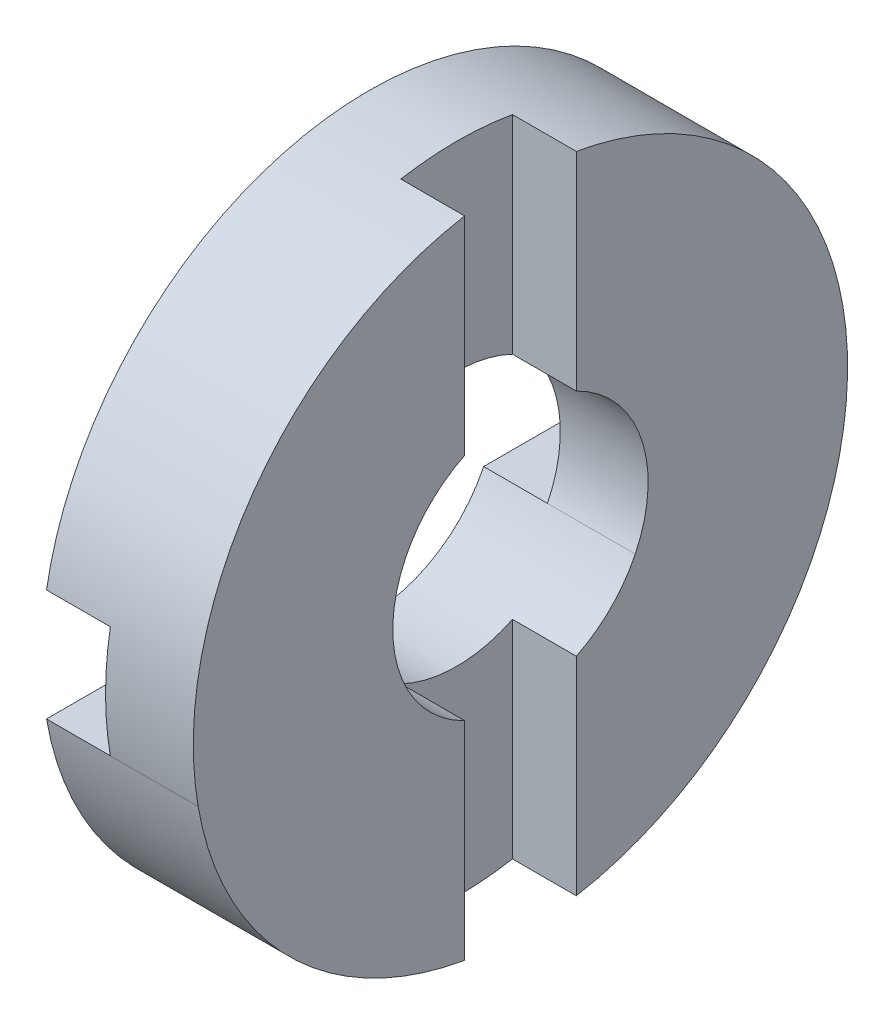
ISO-10303-21;
HEADER;
FILE_DESCRIPTION(('STEP AP214'),'2;1');
FILE_NAME('part.step','',(''),(''),'','','');
FILE_SCHEMA(('AUTOMOTIVE_DESIGN { 1 0 10303 214 1 1 1 1 }'));
ENDSEC;
DATA;
#1=APPLICATION_CONTEXT('core data for automotive mechanical design processes');
#2=APPLICATION_PROTOCOL_DEFINITION('international standard','automotive_design',2000,#1);
#3=PRODUCT_CONTEXT('',#1,'mechanical');
#4=PRODUCT('Part','Part','',(#3));
#5=PRODUCT_RELATED_PRODUCT_CATEGORY('part','',(#4));
#6=PRODUCT_DEFINITION_FORMATION('','',#4);
#7=PRODUCT_DEFINITION_CONTEXT('part definition',#1,'design');
#8=PRODUCT_DEFINITION('design','',#6,#7);
#9=PRODUCT_DEFINITION_SHAPE('','',#8);
#10=(LENGTH_UNIT() NAMED_UNIT(*) SI_UNIT(.MILLI.,.METRE.));
#11=(NAMED_UNIT(*) PLANE_ANGLE_UNIT() SI_UNIT($,.RADIAN.));
#12=(NAMED_UNIT(*) SI_UNIT($,.STERADIAN.) SOLID_ANGLE_UNIT());
#13=UNCERTAINTY_MEASURE_WITH_UNIT(LENGTH_MEASURE(1.E-05),#10,'distance_accuracy_value','');
#14=(GEOMETRIC_REPRESENTATION_CONTEXT(3) GLOBAL_UNCERTAINTY_ASSIGNED_CONTEXT((#13)) GLOBAL_UNIT_ASSIGNED_CONTEXT((#10,
#11,#12)) REPRESENTATION_CONTEXT('',''));
#15=CARTESIAN_POINT('',(0.,0.,0.));
#16=DIRECTION('',(0.,0.,1.));
#17=DIRECTION('',(1.,0.,0.));
#18=AXIS2_PLACEMENT_3D('',#15,#16,#17);
#19=CARTESIAN_POINT('',(9.5,8.,0.));
#20=DIRECTION('',(1.,0.,0.));
#21=DIRECTION('',(0.,0.,-1.));
#22=AXIS2_PLACEMENT_3D('',#19,#20,#21);
#23=PLANE('',#22);
#24=CARTESIAN_POINT('',(9.5,0.,0.));
#25=DIRECTION('',(1.,0.,0.));
#26=DIRECTION('',(0.,0.,-1.));
#27=AXIS2_PLACEMENT_3D('',#24,#25,#26);
#28=CIRCLE('',#27,20.5);
#29=CARTESIAN_POINT('',(9.5,-20.1990098767242,-3.5));
#30=VERTEX_POINT('',#29);
#31=CARTESIAN_POINT('',(9.5,3.5,-20.1990098767242));
#32=VERTEX_POINT('',#31);
#33=EDGE_CURVE('E11',#30,#32,#28,.T.);
#34=ORIENTED_EDGE('',*,*,#33,.T.);
#35=CARTESIAN_POINT('',(9.5,0.,0.));
#36=DIRECTION('',(1.,0.,0.));
#37=DIRECTION('',(0.,0.,-1.));
#38=AXIS2_PLACEMENT_3D('',#35,#36,#37);
#39=CIRCLE('',#38,20.5);
#40=CARTESIAN_POINT('',(9.5,20.1990098767242,-3.5));
#41=VERTEX_POINT('',#40);
#42=EDGE_CURVE('E24',#32,#41,#39,.T.);
#43=ORIENTED_EDGE('',*,*,#42,.T.);
#44=DIRECTION('',(0.,-1.,0.));
#45=VECTOR('',#44,1.);
#46=CARTESIAN_POINT('',(9.5,20.5,-3.5));
#47=LINE('',#46,#45);
#48=CARTESIAN_POINT('',(9.5,7.19374728496908,-3.5));
#49=VERTEX_POINT('',#48);
#50=EDGE_CURVE('E378',#41,#49,#47,.T.);
#51=ORIENTED_EDGE('',*,*,#50,.T.);
#52=CARTESIAN_POINT('',(9.5,0.,0.));
#53=DIRECTION('',(1.,0.,0.));
#54=DIRECTION('',(0.,0.,-1.));
#55=AXIS2_PLACEMENT_3D('',#52,#53,#54);
#56=CIRCLE('',#55,8.);
#57=CARTESIAN_POINT('',(9.5,-3.5,-7.19374728496908));
#58=VERTEX_POINT('',#57);
#59=EDGE_CURVE('E373',#58,#49,#56,.T.);
#60=ORIENTED_EDGE('',*,*,#59,.F.);
#61=CARTESIAN_POINT('',(9.5,0.,0.));
#62=DIRECTION('',(1.,0.,0.));
#63=DIRECTION('',(0.,0.,-1.));
#64=AXIS2_PLACEMENT_3D('',#61,#62,#63);
#65=CIRCLE('',#64,8.);
#66=CARTESIAN_POINT('',(9.5,-7.19374728496908,-3.5));
#67=VERTEX_POINT('',#66);
#68=EDGE_CURVE('E368',#67,#58,#65,.T.);
#69=ORIENTED_EDGE('',*,*,#68,.F.);
#70=DIRECTION('',(0.,-1.,0.));
#71=VECTOR('',#70,1.);
#72=CARTESIAN_POINT('',(9.5,8.,-3.5));
#73=LINE('',#72,#71);
#74=EDGE_CURVE('E364',#67,#30,#73,.T.);
#75=ORIENTED_EDGE('',*,*,#74,.T.);
#76=EDGE_LOOP('',(#34,#43,#51,#60,#69,#75));
#77=FACE_BOUND('',#76,.T.);
#78=ADVANCED_FACE('F16',(#77),#23,.T.);
#79=CARTESIAN_POINT('',(9.5,20.5,-3.5));
#80=DIRECTION('',(0.,0.,1.));
#81=DIRECTION('',(1.,0.,0.));
#82=AXIS2_PLACEMENT_3D('',#79,#80,#81);
#83=PLANE('',#82);
#84=DIRECTION('',(0.,-1.,0.));
#85=VECTOR('',#84,1.);
#86=CARTESIAN_POINT('',(5.5,20.5,-3.5));
#87=LINE('',#86,#85);
#88=CARTESIAN_POINT('',(5.5,-7.19374728496908,-3.5));
#89=VERTEX_POINT('',#88);
#90=CARTESIAN_POINT('',(5.5,-20.1990098767242,-3.5));
#91=VERTEX_POINT('',#90);
#92=EDGE_CURVE('E360',#89,#91,#87,.T.);
#93=ORIENTED_EDGE('',*,*,#92,.T.);
#94=DIRECTION('',(1.,0.,0.));
#95=VECTOR('',#94,1.);
#96=CARTESIAN_POINT('',(9.5,-20.1990098767242,-3.5));
#97=LINE('',#96,#95);
#98=EDGE_CURVE('E355',#91,#30,#97,.T.);
#99=ORIENTED_EDGE('',*,*,#98,.T.);
#100=ORIENTED_EDGE('',*,*,#74,.F.);
#101=DIRECTION('',(1.,0.,0.));
#102=VECTOR('',#101,1.);
#103=CARTESIAN_POINT('',(9.5,-7.19374728496908,-3.5));
#104=LINE('',#103,#102);
#105=EDGE_CURVE('E350',#89,#67,#104,.T.);
#106=ORIENTED_EDGE('',*,*,#105,.F.);
#107=EDGE_LOOP('',(#93,#99,#100,#106));
#108=FACE_BOUND('',#107,.T.);
#109=ADVANCED_FACE('F439',(#108),#83,.T.);
#110=CARTESIAN_POINT('',(9.5,0.,0.));
#111=DIRECTION('',(-1.,0.,0.));
#112=DIRECTION('',(0.,0.899218410621135,-0.4375));
#113=AXIS2_PLACEMENT_3D('',#110,#111,#112);
#114=CYLINDRICAL_SURFACE('',#113,8.);
#115=CARTESIAN_POINT('',(4.,0.,0.));
#116=DIRECTION('',(-1.,0.,0.));
#117=DIRECTION('',(0.,0.,1.));
#118=AXIS2_PLACEMENT_3D('',#115,#116,#117);
#119=CIRCLE('',#118,8.);
#120=CARTESIAN_POINT('',(4.,-3.5,7.19374728496908));
#121=VERTEX_POINT('',#120);
#122=CARTESIAN_POINT('',(4.,3.5,7.19374728496908));
#123=VERTEX_POINT('',#122);
#124=EDGE_CURVE('E346',#121,#123,#119,.T.);
#125=ORIENTED_EDGE('',*,*,#124,.T.);
#126=DIRECTION('',(-1.,0.,0.));
#127=VECTOR('',#126,1.);
#128=CARTESIAN_POINT('',(9.5,3.5,7.19374728496908));
#129=LINE('',#128,#127);
#130=CARTESIAN_POINT('',(9.5,3.5,7.19374728496908));
#131=VERTEX_POINT('',#130);
#132=EDGE_CURVE('E341',#131,#123,#129,.T.);
#133=ORIENTED_EDGE('',*,*,#132,.F.);
#134=CARTESIAN_POINT('',(9.5,0.,0.));
#135=DIRECTION('',(1.,0.,0.));
#136=DIRECTION('',(0.,0.,-1.));
#137=AXIS2_PLACEMENT_3D('',#134,#135,#136);
#138=CIRCLE('',#137,8.);
#139=CARTESIAN_POINT('',(9.5,-7.19374728496908,3.5));
#140=VERTEX_POINT('',#139);
#141=EDGE_CURVE('E337',#131,#140,#138,.T.);
#142=ORIENTED_EDGE('',*,*,#141,.T.);
#143=DIRECTION('',(1.,0.,0.));
#144=VECTOR('',#143,1.);
#145=CARTESIAN_POINT('',(9.5,-7.19374728496908,3.5));
#146=LINE('',#145,#144);
#147=CARTESIAN_POINT('',(5.5,-7.19374728496908,3.5));
#148=VERTEX_POINT('',#147);
#149=EDGE_CURVE('E332',#148,#140,#146,.T.);
#150=ORIENTED_EDGE('',*,*,#149,.F.);
#151=CARTESIAN_POINT('',(5.5,0.,0.));
#152=DIRECTION('',(1.,0.,0.));
#153=DIRECTION('',(0.,0.,-1.));
#154=AXIS2_PLACEMENT_3D('',#151,#152,#153);
#155=CIRCLE('',#154,8.);
#156=EDGE_CURVE('E327',#148,#89,#155,.T.);
#157=ORIENTED_EDGE('',*,*,#156,.T.);
#158=ORIENTED_EDGE('',*,*,#105,.T.);
#159=ORIENTED_EDGE('',*,*,#68,.T.);
#160=DIRECTION('',(-1.,0.,0.));
#161=VECTOR('',#160,1.);
#162=CARTESIAN_POINT('',(9.5,-3.5,-7.19374728496908));
#163=LINE('',#162,#161);
#164=CARTESIAN_POINT('',(4.,-3.5,-7.19374728496908));
#165=VERTEX_POINT('',#164);
#166=EDGE_CURVE('E323',#58,#165,#163,.T.);
#167=ORIENTED_EDGE('',*,*,#166,.T.);
#168=DIRECTION('',(1.,0.,0.));
#169=VECTOR('',#168,1.);
#170=CARTESIAN_POINT('',(9.5,-3.5,-7.19374728496908));
#171=LINE('',#170,#169);
#172=CARTESIAN_POINT('',(0.,-3.5,-7.19374728496908));
#173=VERTEX_POINT('',#172);
#174=EDGE_CURVE('E318',#173,#165,#171,.T.);
#175=ORIENTED_EDGE('',*,*,#174,.F.);
#176=CARTESIAN_POINT('',(0.,0.,0.));
#177=DIRECTION('',(1.,0.,0.));
#178=DIRECTION('',(0.,0.,-1.));
#179=AXIS2_PLACEMENT_3D('',#176,#177,#178);
#180=CIRCLE('',#179,8.);
#181=CARTESIAN_POINT('',(0.,-3.5,7.19374728496908));
#182=VERTEX_POINT('',#181);
#183=EDGE_CURVE('E313',#182,#173,#180,.T.);
#184=ORIENTED_EDGE('',*,*,#183,.F.);
#185=DIRECTION('',(1.,0.,0.));
#186=VECTOR('',#185,1.);
#187=CARTESIAN_POINT('',(9.5,-3.5,7.19374728496908));
#188=LINE('',#187,#186);
#189=EDGE_CURVE('E309',#182,#121,#188,.T.);
#190=ORIENTED_EDGE('',*,*,#189,.T.);
#191=EDGE_LOOP('',(#125,#133,#142,#150,#157,#158,#159,#167,#175,#184,#190));
#192=FACE_BOUND('',#191,.T.);
#193=ADVANCED_FACE('F412',(#192),#114,.F.);
#194=CARTESIAN_POINT('',(0.,-3.5,20.5));
#195=DIRECTION('',(0.,1.,0.));
#196=DIRECTION('',(0.,0.,1.));
#197=AXIS2_PLACEMENT_3D('',#194,#195,#196);
#198=PLANE('',#197);
#199=DIRECTION('',(0.,0.,-1.));
#200=VECTOR('',#199,1.);
#201=CARTESIAN_POINT('',(0.,-3.5,20.5));
#202=LINE('',#201,#200);
#203=CARTESIAN_POINT('',(0.,-3.5,20.1990098767242));
#204=VERTEX_POINT('',#203);
#205=EDGE_CURVE('E304',#204,#182,#202,.T.);
#206=ORIENTED_EDGE('',*,*,#205,.F.);
#207=DIRECTION('',(1.,0.,0.));
#208=VECTOR('',#207,1.);
#209=CARTESIAN_POINT('',(9.5,-3.5,20.1990098767242));
#210=LINE('',#209,#208);
#211=CARTESIAN_POINT('',(4.,-3.5,20.1990098767242));
#212=VERTEX_POINT('',#211);
#213=EDGE_CURVE('E300',#204,#212,#210,.T.);
#214=ORIENTED_EDGE('',*,*,#213,.T.);
#215=DIRECTION('',(0.,0.,-1.));
#216=VECTOR('',#215,1.);
#217=CARTESIAN_POINT('',(4.,-3.5,20.5));
#218=LINE('',#217,#216);
#219=EDGE_CURVE('E295',#212,#121,#218,.T.);
#220=ORIENTED_EDGE('',*,*,#219,.T.);
#221=ORIENTED_EDGE('',*,*,#189,.F.);
#222=EDGE_LOOP('',(#206,#214,#220,#221));
#223=FACE_BOUND('',#222,.T.);
#224=ADVANCED_FACE('F456',(#223),#198,.T.);
#225=CARTESIAN_POINT('',(4.,-3.5,20.5));
#226=DIRECTION('',(-1.,0.,0.));
#227=DIRECTION('',(0.,0.,1.));
#228=AXIS2_PLACEMENT_3D('',#225,#226,#227);
#229=PLANE('',#228);
#230=ORIENTED_EDGE('',*,*,#219,.F.);
#231=CARTESIAN_POINT('',(4.,0.,0.));
#232=DIRECTION('',(-1.,0.,0.));
#233=DIRECTION('',(0.,0.,1.));
#234=AXIS2_PLACEMENT_3D('',#231,#232,#233);
#235=CIRCLE('',#234,20.5);
#236=CARTESIAN_POINT('',(4.,3.5,20.1990098767242));
#237=VERTEX_POINT('',#236);
#238=EDGE_CURVE('E291',#212,#237,#235,.T.);
#239=ORIENTED_EDGE('',*,*,#238,.T.);
#240=DIRECTION('',(0.,0.,-1.));
#241=VECTOR('',#240,1.);
#242=CARTESIAN_POINT('',(4.,3.5,20.5));
#243=LINE('',#242,#241);
#244=EDGE_CURVE('E286',#237,#123,#243,.T.);
#245=ORIENTED_EDGE('',*,*,#244,.T.);
#246=ORIENTED_EDGE('',*,*,#124,.F.);
#247=EDGE_LOOP('',(#230,#239,#245,#246));
#248=FACE_BOUND('',#247,.T.);
#249=ADVANCED_FACE('F418',(#248),#229,.T.);
#250=CARTESIAN_POINT('',(4.,3.5,20.5));
#251=DIRECTION('',(0.,-1.,0.));
#252=DIRECTION('',(0.,0.,-1.));
#253=AXIS2_PLACEMENT_3D('',#250,#251,#252);
#254=PLANE('',#253);
#255=ORIENTED_EDGE('',*,*,#244,.F.);
#256=DIRECTION('',(1.,0.,0.));
#257=VECTOR('',#256,1.);
#258=CARTESIAN_POINT('',(9.5,3.5,20.1990098767242));
#259=LINE('',#258,#257);
#260=CARTESIAN_POINT('',(0.,3.5,20.1990098767242));
#261=VERTEX_POINT('',#260);
#262=EDGE_CURVE('E282',#261,#237,#259,.T.);
#263=ORIENTED_EDGE('',*,*,#262,.F.);
#264=DIRECTION('',(0.,0.,-1.));
#265=VECTOR('',#264,1.);
#266=CARTESIAN_POINT('',(0.,3.5,20.5));
#267=LINE('',#266,#265);
#268=CARTESIAN_POINT('',(0.,3.5,7.19374728496908));
#269=VERTEX_POINT('',#268);
#270=EDGE_CURVE('E158',#261,#269,#267,.T.);
#271=ORIENTED_EDGE('',*,*,#270,.T.);
#272=DIRECTION('',(1.,0.,0.));
#273=VECTOR('',#272,1.);
#274=CARTESIAN_POINT('',(9.5,3.5,7.19374728496908));
#275=LINE('',#274,#273);
#276=EDGE_CURVE('E274',#269,#123,#275,.T.);
#277=ORIENTED_EDGE('',*,*,#276,.T.);
#278=EDGE_LOOP('',(#255,#263,#271,#277));
#279=FACE_BOUND('',#278,.T.);
#280=ADVANCED_FACE('F421',(#279),#254,.T.);
#281=CARTESIAN_POINT('',(9.5,0.,0.));
#282=DIRECTION('',(-1.,0.,0.));
#283=DIRECTION('',(0.,-0.899218410621135,0.4375));
#284=AXIS2_PLACEMENT_3D('',#281,#282,#283);
#285=CYLINDRICAL_SURFACE('',#284,8.);
#286=CARTESIAN_POINT('',(9.5,0.,0.));
#287=DIRECTION('',(1.,0.,0.));
#288=DIRECTION('',(0.,0.,-1.));
#289=AXIS2_PLACEMENT_3D('',#286,#287,#288);
#290=CIRCLE('',#289,8.);
#291=CARTESIAN_POINT('',(9.5,7.19374728496908,3.5));
#292=VERTEX_POINT('',#291);
#293=EDGE_CURVE('E269',#292,#131,#290,.T.);
#294=ORIENTED_EDGE('',*,*,#293,.T.);
#295=ORIENTED_EDGE('',*,*,#132,.T.);
#296=ORIENTED_EDGE('',*,*,#276,.F.);
#297=CARTESIAN_POINT('',(0.,0.,0.));
#298=DIRECTION('',(1.,0.,0.));
#299=DIRECTION('',(0.,0.,-1.));
#300=AXIS2_PLACEMENT_3D('',#297,#298,#299);
#301=CIRCLE('',#300,8.);
#302=CARTESIAN_POINT('',(0.,3.5,-7.19374728496908));
#303=VERTEX_POINT('',#302);
#304=EDGE_CURVE('E265',#303,#269,#301,.T.);
#305=ORIENTED_EDGE('',*,*,#304,.F.);
#306=DIRECTION('',(1.,0.,0.));
#307=VECTOR('',#306,1.);
#308=CARTESIAN_POINT('',(9.5,3.5,-7.19374728496908));
#309=LINE('',#308,#307);
#310=CARTESIAN_POINT('',(4.,3.5,-7.19374728496908));
#311=VERTEX_POINT('',#310);
#312=EDGE_CURVE('E161',#303,#311,#309,.T.);
#313=ORIENTED_EDGE('',*,*,#312,.T.);
#314=CARTESIAN_POINT('',(4.,0.,0.));
#315=DIRECTION('',(-1.,0.,0.));
#316=DIRECTION('',(0.,0.,1.));
#317=AXIS2_PLACEMENT_3D('',#314,#315,#316);
#318=CIRCLE('',#317,8.);
#319=EDGE_CURVE('E257',#311,#165,#318,.T.);
#320=ORIENTED_EDGE('',*,*,#319,.T.);
#321=ORIENTED_EDGE('',*,*,#166,.F.);
#322=ORIENTED_EDGE('',*,*,#59,.T.);
#323=DIRECTION('',(1.,0.,0.));
#324=VECTOR('',#323,1.);
#325=CARTESIAN_POINT('',(9.5,7.19374728496908,-3.5));
#326=LINE('',#325,#324);
#327=CARTESIAN_POINT('',(5.5,7.19374728496908,-3.5));
#328=VERTEX_POINT('',#327);
#329=EDGE_CURVE('E252',#328,#49,#326,.T.);
#330=ORIENTED_EDGE('',*,*,#329,.F.);
#331=CARTESIAN_POINT('',(5.5,0.,0.));
#332=DIRECTION('',(1.,0.,0.));
#333=DIRECTION('',(0.,0.,-1.));
#334=AXIS2_PLACEMENT_3D('',#331,#332,#333);
#335=CIRCLE('',#334,8.);
#336=CARTESIAN_POINT('',(5.5,7.19374728496908,3.5));
#337=VERTEX_POINT('',#336);
#338=EDGE_CURVE('E248',#328,#337,#335,.T.);
#339=ORIENTED_EDGE('',*,*,#338,.T.);
#340=DIRECTION('',(1.,0.,0.));
#341=VECTOR('',#340,1.);
#342=CARTESIAN_POINT('',(9.5,7.19374728496908,3.5));
#343=LINE('',#342,#341);
#344=EDGE_CURVE('E244',#337,#292,#343,.T.);
#345=ORIENTED_EDGE('',*,*,#344,.T.);
#346=EDGE_LOOP('',(#294,#295,#296,#305,#313,#320,#321,#322,#330,#339,#345));
#347=FACE_BOUND('',#346,.T.);
#348=ADVANCED_FACE('F391',(#347),#285,.F.);
#349=CARTESIAN_POINT('',(5.5,20.5,3.5));
#350=DIRECTION('',(0.,0.,-1.));
#351=DIRECTION('',(-1.,0.,0.));
#352=AXIS2_PLACEMENT_3D('',#349,#350,#351);
#353=PLANE('',#352);
#354=DIRECTION('',(0.,-1.,0.));
#355=VECTOR('',#354,1.);
#356=CARTESIAN_POINT('',(5.5,20.5,3.5));
#357=LINE('',#356,#355);
#358=CARTESIAN_POINT('',(5.5,20.1990098767242,3.5));
#359=VERTEX_POINT('',#358);
#360=EDGE_CURVE('E239',#359,#337,#357,.T.);
#361=ORIENTED_EDGE('',*,*,#360,.F.);
#362=DIRECTION('',(1.,0.,0.));
#363=VECTOR('',#362,1.);
#364=CARTESIAN_POINT('',(9.5,20.1990098767242,3.5));
#365=LINE('',#364,#363);
#366=CARTESIAN_POINT('',(9.5,20.1990098767242,3.5));
#367=VERTEX_POINT('',#366);
#368=EDGE_CURVE('E235',#359,#367,#365,.T.);
#369=ORIENTED_EDGE('',*,*,#368,.T.);
#370=DIRECTION('',(0.,-1.,0.));
#371=VECTOR('',#370,1.);
#372=CARTESIAN_POINT('',(9.5,20.5,3.5));
#373=LINE('',#372,#371);
#374=EDGE_CURVE('E230',#367,#292,#373,.T.);
#375=ORIENTED_EDGE('',*,*,#374,.T.);
#376=ORIENTED_EDGE('',*,*,#344,.F.);
#377=EDGE_LOOP('',(#361,#369,#375,#376));
#378=FACE_BOUND('',#377,.T.);
#379=ADVANCED_FACE('F403',(#378),#353,.T.);
#380=CARTESIAN_POINT('',(9.5,8.,0.));
#381=DIRECTION('',(1.,0.,0.));
#382=DIRECTION('',(0.,0.,-1.));
#383=AXIS2_PLACEMENT_3D('',#380,#381,#382);
#384=PLANE('',#383);
#385=CARTESIAN_POINT('',(9.5,0.,0.));
#386=DIRECTION('',(1.,0.,0.));
#387=DIRECTION('',(0.,0.,-1.));
#388=AXIS2_PLACEMENT_3D('',#385,#386,#387);
#389=CIRCLE('',#388,20.5);
#390=CARTESIAN_POINT('',(9.5,-3.5,20.1990098767242));
#391=VERTEX_POINT('',#390);
#392=EDGE_CURVE('E226',#367,#391,#389,.T.);
#393=ORIENTED_EDGE('',*,*,#392,.T.);
#394=CARTESIAN_POINT('',(9.5,0.,0.));
#395=DIRECTION('',(1.,0.,0.));
#396=DIRECTION('',(0.,0.,-1.));
#397=AXIS2_PLACEMENT_3D('',#394,#395,#396);
#398=CIRCLE('',#397,20.5);
#399=CARTESIAN_POINT('',(9.5,-20.1990098767242,3.5));
#400=VERTEX_POINT('',#399);
#401=EDGE_CURVE('E222',#391,#400,#398,.T.);
#402=ORIENTED_EDGE('',*,*,#401,.T.);
#403=DIRECTION('',(0.,1.,0.));
#404=VECTOR('',#403,1.);
#405=CARTESIAN_POINT('',(9.5,8.,3.5));
#406=LINE('',#405,#404);
#407=EDGE_CURVE('E217',#400,#140,#406,.T.);
#408=ORIENTED_EDGE('',*,*,#407,.T.);
#409=ORIENTED_EDGE('',*,*,#141,.F.);
#410=ORIENTED_EDGE('',*,*,#293,.F.);
#411=ORIENTED_EDGE('',*,*,#374,.F.);
#412=EDGE_LOOP('',(#393,#402,#408,#409,#410,#411));
#413=FACE_BOUND('',#412,.T.);
#414=ADVANCED_FACE('F409',(#413),#384,.T.);
#415=CARTESIAN_POINT('',(5.5,20.5,3.5));
#416=DIRECTION('',(0.,0.,-1.));
#417=DIRECTION('',(-1.,0.,0.));
#418=AXIS2_PLACEMENT_3D('',#415,#416,#417);
#419=PLANE('',#418);
#420=ORIENTED_EDGE('',*,*,#407,.F.);
#421=DIRECTION('',(1.,0.,0.));
#422=VECTOR('',#421,1.);
#423=CARTESIAN_POINT('',(9.5,-20.1990098767242,3.5));
#424=LINE('',#423,#422);
#425=CARTESIAN_POINT('',(5.5,-20.1990098767242,3.5));
#426=VERTEX_POINT('',#425);
#427=EDGE_CURVE('E212',#426,#400,#424,.T.);
#428=ORIENTED_EDGE('',*,*,#427,.F.);
#429=DIRECTION('',(0.,-1.,0.));
#430=VECTOR('',#429,1.);
#431=CARTESIAN_POINT('',(5.5,20.5,3.5));
#432=LINE('',#431,#430);
#433=EDGE_CURVE('E207',#148,#426,#432,.T.);
#434=ORIENTED_EDGE('',*,*,#433,.F.);
#435=ORIENTED_EDGE('',*,*,#149,.T.);
#436=EDGE_LOOP('',(#420,#428,#434,#435));
#437=FACE_BOUND('',#436,.T.);
#438=ADVANCED_FACE('F431',(#437),#419,.T.);
#439=CARTESIAN_POINT('',(5.5,20.5,-3.5));
#440=DIRECTION('',(1.,0.,0.));
#441=DIRECTION('',(0.,0.,-1.));
#442=AXIS2_PLACEMENT_3D('',#439,#440,#441);
#443=PLANE('',#442);
#444=ORIENTED_EDGE('',*,*,#433,.T.);
#445=CARTESIAN_POINT('',(5.5,0.,0.));
#446=DIRECTION('',(1.,0.,0.));
#447=DIRECTION('',(0.,0.,-1.));
#448=AXIS2_PLACEMENT_3D('',#445,#446,#447);
#449=CIRCLE('',#448,20.5);
#450=EDGE_CURVE('E202',#426,#91,#449,.T.);
#451=ORIENTED_EDGE('',*,*,#450,.T.);
#452=ORIENTED_EDGE('',*,*,#92,.F.);
#453=ORIENTED_EDGE('',*,*,#156,.F.);
#454=EDGE_LOOP('',(#444,#451,#452,#453));
#455=FACE_BOUND('',#454,.T.);
#456=ADVANCED_FACE('F436',(#455),#443,.T.);
#457=CARTESIAN_POINT('',(9.5,0.,0.));
#458=DIRECTION('',(-1.,0.,0.));
#459=DIRECTION('',(0.,0.985317554962154,0.170731707317073));
#460=AXIS2_PLACEMENT_3D('',#457,#458,#459);
#461=CYLINDRICAL_SURFACE('',#460,20.5);
#462=ORIENTED_EDGE('',*,*,#213,.F.);
#463=CARTESIAN_POINT('',(0.,0.,0.));
#464=DIRECTION('',(1.,0.,0.));
#465=DIRECTION('',(0.,0.,-1.));
#466=AXIS2_PLACEMENT_3D('',#463,#464,#465);
#467=CIRCLE('',#466,20.5);
#468=CARTESIAN_POINT('',(0.,-3.5,-20.1990098767242));
#469=VERTEX_POINT('',#468);
#470=EDGE_CURVE('E198',#204,#469,#467,.T.);
#471=ORIENTED_EDGE('',*,*,#470,.T.);
#472=DIRECTION('',(1.,0.,0.));
#473=VECTOR('',#472,1.);
#474=CARTESIAN_POINT('',(9.5,-3.5,-20.1990098767242));
#475=LINE('',#474,#473);
#476=CARTESIAN_POINT('',(4.,-3.5,-20.1990098767242));
#477=VERTEX_POINT('',#476);
#478=EDGE_CURVE('E194',#469,#477,#475,.T.);
#479=ORIENTED_EDGE('',*,*,#478,.T.);
#480=CARTESIAN_POINT('',(4.,0.,0.));
#481=DIRECTION('',(-1.,0.,0.));
#482=DIRECTION('',(0.,0.,1.));
#483=AXIS2_PLACEMENT_3D('',#480,#481,#482);
#484=CIRCLE('',#483,20.5);
#485=CARTESIAN_POINT('',(4.,3.5,-20.1990098767242));
#486=VERTEX_POINT('',#485);
#487=EDGE_CURVE('E189',#486,#477,#484,.T.);
#488=ORIENTED_EDGE('',*,*,#487,.F.);
#489=DIRECTION('',(-1.,0.,0.));
#490=VECTOR('',#489,1.);
#491=CARTESIAN_POINT('',(9.5,3.5,-20.1990098767242));
#492=LINE('',#491,#490);
#493=EDGE_CURVE('E145',#32,#486,#492,.T.);
#494=ORIENTED_EDGE('',*,*,#493,.F.);
#495=ORIENTED_EDGE('',*,*,#33,.F.);
#496=ORIENTED_EDGE('',*,*,#98,.F.);
#497=ORIENTED_EDGE('',*,*,#450,.F.);
#498=ORIENTED_EDGE('',*,*,#427,.T.);
#499=ORIENTED_EDGE('',*,*,#401,.F.);
#500=DIRECTION('',(-1.,0.,0.));
#501=VECTOR('',#500,1.);
#502=CARTESIAN_POINT('',(9.5,-3.5,20.1990098767242));
#503=LINE('',#502,#501);
#504=EDGE_CURVE('E181',#391,#212,#503,.T.);
#505=ORIENTED_EDGE('',*,*,#504,.T.);
#506=EDGE_LOOP('',(#462,#471,#479,#488,#494,#495,#496,#497,#498,#499,#505));
#507=FACE_BOUND('',#506,.T.);
#508=ADVANCED_FACE('F426',(#507),#461,.T.);
#509=CARTESIAN_POINT('',(9.5,0.,0.));
#510=DIRECTION('',(-1.,0.,0.));
#511=DIRECTION('',(0.,-0.985317554962154,-0.170731707317072));
#512=AXIS2_PLACEMENT_3D('',#509,#510,#511);
#513=CYLINDRICAL_SURFACE('',#512,20.5);
#514=ORIENTED_EDGE('',*,*,#392,.F.);
#515=ORIENTED_EDGE('',*,*,#368,.F.);
#516=CARTESIAN_POINT('',(5.5,0.,0.));
#517=DIRECTION('',(1.,0.,0.));
#518=DIRECTION('',(0.,0.,-1.));
#519=AXIS2_PLACEMENT_3D('',#516,#517,#518);
#520=CIRCLE('',#519,20.5);
#521=CARTESIAN_POINT('',(5.5,20.1990098767242,-3.5));
#522=VERTEX_POINT('',#521);
#523=EDGE_CURVE('E176',#522,#359,#520,.T.);
#524=ORIENTED_EDGE('',*,*,#523,.F.);
#525=DIRECTION('',(1.,0.,0.));
#526=VECTOR('',#525,1.);
#527=CARTESIAN_POINT('',(9.5,20.1990098767242,-3.5));
#528=LINE('',#527,#526);
#529=EDGE_CURVE('E150',#522,#41,#528,.T.);
#530=ORIENTED_EDGE('',*,*,#529,.T.);
#531=ORIENTED_EDGE('',*,*,#42,.F.);
#532=ORIENTED_EDGE('',*,*,#493,.T.);
#533=DIRECTION('',(1.,0.,0.));
#534=VECTOR('',#533,1.);
#535=CARTESIAN_POINT('',(9.5,3.5,-20.1990098767242));
#536=LINE('',#535,#534);
#537=CARTESIAN_POINT('',(0.,3.5,-20.1990098767242));
#538=VERTEX_POINT('',#537);
#539=EDGE_CURVE('E138',#538,#486,#536,.T.);
#540=ORIENTED_EDGE('',*,*,#539,.F.);
#541=CARTESIAN_POINT('',(0.,0.,0.));
#542=DIRECTION('',(1.,0.,0.));
#543=DIRECTION('',(0.,0.,-1.));
#544=AXIS2_PLACEMENT_3D('',#541,#542,#543);
#545=CIRCLE('',#544,20.5);
#546=EDGE_CURVE('E143',#538,#261,#545,.T.);
#547=ORIENTED_EDGE('',*,*,#546,.T.);
#548=ORIENTED_EDGE('',*,*,#262,.T.);
#549=ORIENTED_EDGE('',*,*,#238,.F.);
#550=ORIENTED_EDGE('',*,*,#504,.F.);
#551=EDGE_LOOP('',(#514,#515,#524,#530,#531,#532,#540,#547,#548,#549,#550));
#552=FACE_BOUND('',#551,.T.);
#553=ADVANCED_FACE('F141',(#552),#513,.T.);
#554=CARTESIAN_POINT('',(0.,20.5,0.));
#555=DIRECTION('',(-1.,0.,0.));
#556=DIRECTION('',(0.,0.,1.));
#557=AXIS2_PLACEMENT_3D('',#554,#555,#556);
#558=PLANE('',#557);
#559=ORIENTED_EDGE('',*,*,#304,.T.);
#560=ORIENTED_EDGE('',*,*,#270,.F.);
#561=ORIENTED_EDGE('',*,*,#546,.F.);
#562=DIRECTION('',(0.,0.,-1.));
#563=VECTOR('',#562,1.);
#564=CARTESIAN_POINT('',(0.,3.5,20.5));
#565=LINE('',#564,#563);
#566=EDGE_CURVE('E156',#303,#538,#565,.T.);
#567=ORIENTED_EDGE('',*,*,#566,.F.);
#568=EDGE_LOOP('',(#559,#560,#561,#567));
#569=FACE_BOUND('',#568,.T.);
#570=ADVANCED_FACE('F155',(#569),#558,.T.);
#571=CARTESIAN_POINT('',(4.,3.5,20.5));
#572=DIRECTION('',(0.,-1.,0.));
#573=DIRECTION('',(0.,0.,-1.));
#574=AXIS2_PLACEMENT_3D('',#571,#572,#573);
#575=PLANE('',#574);
#576=ORIENTED_EDGE('',*,*,#566,.T.);
#577=ORIENTED_EDGE('',*,*,#539,.T.);
#578=DIRECTION('',(0.,0.,-1.));
#579=VECTOR('',#578,1.);
#580=CARTESIAN_POINT('',(4.,3.5,20.5));
#581=LINE('',#580,#579);
#582=EDGE_CURVE('E162',#311,#486,#581,.T.);
#583=ORIENTED_EDGE('',*,*,#582,.F.);
#584=ORIENTED_EDGE('',*,*,#312,.F.);
#585=EDGE_LOOP('',(#576,#577,#583,#584));
#586=FACE_BOUND('',#585,.T.);
#587=ADVANCED_FACE('F160',(#586),#575,.T.);
#588=CARTESIAN_POINT('',(4.,-3.5,20.5));
#589=DIRECTION('',(-1.,0.,0.));
#590=DIRECTION('',(0.,0.,1.));
#591=AXIS2_PLACEMENT_3D('',#588,#589,#590);
#592=PLANE('',#591);
#593=ORIENTED_EDGE('',*,*,#582,.T.);
#594=ORIENTED_EDGE('',*,*,#487,.T.);
#595=DIRECTION('',(0.,0.,-1.));
#596=VECTOR('',#595,1.);
#597=CARTESIAN_POINT('',(4.,-3.5,20.5));
#598=LINE('',#597,#596);
#599=EDGE_CURVE('E164',#165,#477,#598,.T.);
#600=ORIENTED_EDGE('',*,*,#599,.F.);
#601=ORIENTED_EDGE('',*,*,#319,.F.);
#602=EDGE_LOOP('',(#593,#594,#600,#601));
#603=FACE_BOUND('',#602,.T.);
#604=ADVANCED_FACE('F446',(#603),#592,.T.);
#605=CARTESIAN_POINT('',(0.,-3.5,20.5));
#606=DIRECTION('',(0.,1.,0.));
#607=DIRECTION('',(0.,0.,1.));
#608=AXIS2_PLACEMENT_3D('',#605,#606,#607);
#609=PLANE('',#608);
#610=ORIENTED_EDGE('',*,*,#599,.T.);
#611=ORIENTED_EDGE('',*,*,#478,.F.);
#612=DIRECTION('',(0.,0.,-1.));
#613=VECTOR('',#612,1.);
#614=CARTESIAN_POINT('',(0.,-3.5,20.5));
#615=LINE('',#614,#613);
#616=EDGE_CURVE('E398',#173,#469,#615,.T.);
#617=ORIENTED_EDGE('',*,*,#616,.F.);
#618=ORIENTED_EDGE('',*,*,#174,.T.);
#619=EDGE_LOOP('',(#610,#611,#617,#618));
#620=FACE_BOUND('',#619,.T.);
#621=ADVANCED_FACE('F450',(#620),#609,.T.);
#622=CARTESIAN_POINT('',(0.,20.5,0.));
#623=DIRECTION('',(-1.,0.,0.));
#624=DIRECTION('',(0.,0.,1.));
#625=AXIS2_PLACEMENT_3D('',#622,#623,#624);
#626=PLANE('',#625);
#627=ORIENTED_EDGE('',*,*,#470,.F.);
#628=ORIENTED_EDGE('',*,*,#205,.T.);
#629=ORIENTED_EDGE('',*,*,#183,.T.);
#630=ORIENTED_EDGE('',*,*,#616,.T.);
#631=EDGE_LOOP('',(#627,#628,#629,#630));
#632=FACE_BOUND('',#631,.T.);
#633=ADVANCED_FACE('F454',(#632),#626,.T.);
#634=CARTESIAN_POINT('',(9.5,20.5,-3.5));
#635=DIRECTION('',(0.,0.,1.));
#636=DIRECTION('',(1.,0.,0.));
#637=AXIS2_PLACEMENT_3D('',#634,#635,#636);
#638=PLANE('',#637);
#639=ORIENTED_EDGE('',*,*,#50,.F.);
#640=ORIENTED_EDGE('',*,*,#529,.F.);
#641=DIRECTION('',(0.,-1.,0.));
#642=VECTOR('',#641,1.);
#643=CARTESIAN_POINT('',(5.5,20.5,-3.5));
#644=LINE('',#643,#642);
#645=EDGE_CURVE('E395',#522,#328,#644,.T.);
#646=ORIENTED_EDGE('',*,*,#645,.T.);
#647=ORIENTED_EDGE('',*,*,#329,.T.);
#648=EDGE_LOOP('',(#639,#640,#646,#647));
#649=FACE_BOUND('',#648,.T.);
#650=ADVANCED_FACE('F393',(#649),#638,.T.);
#651=CARTESIAN_POINT('',(5.5,20.5,-3.5));
#652=DIRECTION('',(1.,0.,0.));
#653=DIRECTION('',(0.,0.,-1.));
#654=AXIS2_PLACEMENT_3D('',#651,#652,#653);
#655=PLANE('',#654);
#656=ORIENTED_EDGE('',*,*,#645,.F.);
#657=ORIENTED_EDGE('',*,*,#523,.T.);
#658=ORIENTED_EDGE('',*,*,#360,.T.);
#659=ORIENTED_EDGE('',*,*,#338,.F.);
#660=EDGE_LOOP('',(#656,#657,#658,#659));
#661=FACE_BOUND('',#660,.T.);
#662=ADVANCED_FACE('F400',(#661),#655,.T.);
#663=CLOSED_SHELL('',(#78,#109,#193,#224,#249,#280,#348,#379,#414,#438,#456,#508,#553,#570,#587,
#604,#621,#633,#650,#662));
#664=MANIFOLD_SOLID_BREP('B1',#663);
#665=ADVANCED_BREP_SHAPE_REPRESENTATION('',(#18,#664),#14);
#666=SHAPE_DEFINITION_REPRESENTATION(#9,#665);
ENDSEC;
END-ISO-10303-21;
